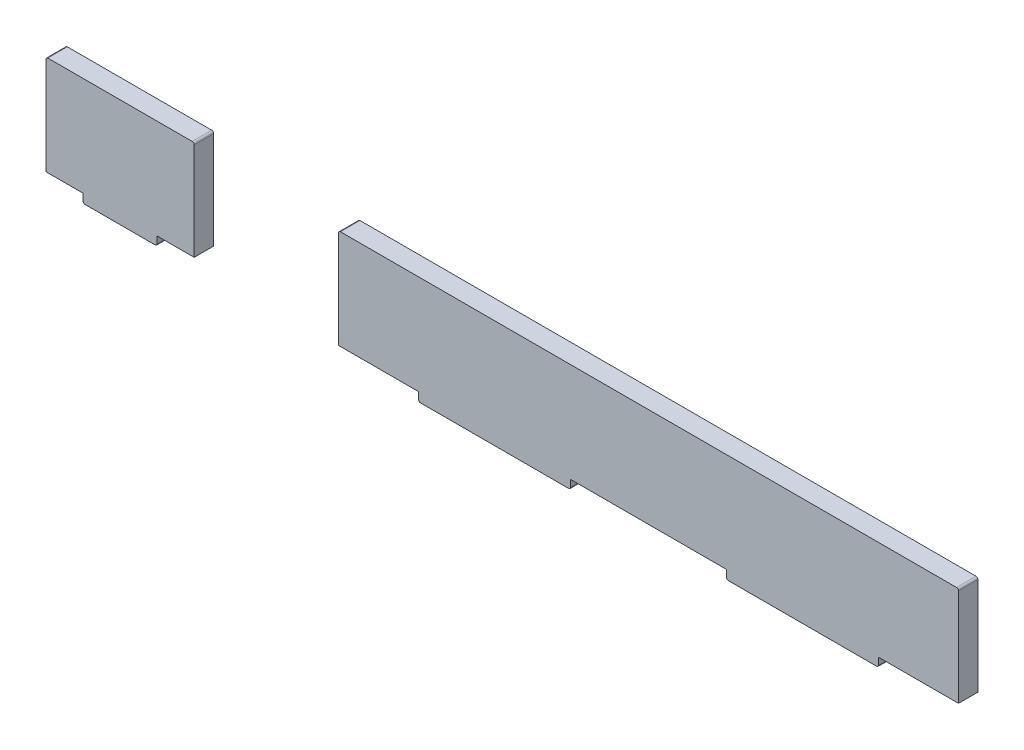
ISO-10303-21;
HEADER;
FILE_DESCRIPTION(('STEP AP214'),'2;1');
FILE_NAME('part.step','',(''),(''),'','','');
FILE_SCHEMA(('AUTOMOTIVE_DESIGN { 1 0 10303 214 1 1 1 1 }'));
ENDSEC;
DATA;
#1=APPLICATION_CONTEXT('core data for automotive mechanical design processes');
#2=APPLICATION_PROTOCOL_DEFINITION('international standard','automotive_design',2000,#1);
#3=PRODUCT_CONTEXT('',#1,'mechanical');
#4=PRODUCT('Part','Part','',(#3));
#5=PRODUCT_RELATED_PRODUCT_CATEGORY('part','',(#4));
#6=PRODUCT_DEFINITION_FORMATION('','',#4);
#7=PRODUCT_DEFINITION_CONTEXT('part definition',#1,'design');
#8=PRODUCT_DEFINITION('design','',#6,#7);
#9=PRODUCT_DEFINITION_SHAPE('','',#8);
#10=(LENGTH_UNIT() NAMED_UNIT(*) SI_UNIT(.MILLI.,.METRE.));
#11=(NAMED_UNIT(*) PLANE_ANGLE_UNIT() SI_UNIT($,.RADIAN.));
#12=(NAMED_UNIT(*) SI_UNIT($,.STERADIAN.) SOLID_ANGLE_UNIT());
#13=UNCERTAINTY_MEASURE_WITH_UNIT(LENGTH_MEASURE(1.E-05),#10,'distance_accuracy_value','');
#14=(GEOMETRIC_REPRESENTATION_CONTEXT(3) GLOBAL_UNCERTAINTY_ASSIGNED_CONTEXT((#13)) GLOBAL_UNIT_ASSIGNED_CONTEXT((#10,
#11,#12)) REPRESENTATION_CONTEXT('',''));
#15=CARTESIAN_POINT('',(0.,0.,0.));
#16=DIRECTION('',(0.,0.,1.));
#17=DIRECTION('',(1.,0.,0.));
#18=AXIS2_PLACEMENT_3D('',#15,#16,#17);
#19=CARTESIAN_POINT('',(41.,0.,10.));
#20=DIRECTION('',(1.,0.,0.));
#21=DIRECTION('',(0.,0.,-1.));
#22=AXIS2_PLACEMENT_3D('',#19,#20,#21);
#23=PLANE('',#22);
#24=DIRECTION('',(0.,-1.,0.));
#25=VECTOR('',#24,1.);
#26=CARTESIAN_POINT('',(41.,0.,0.));
#27=LINE('',#26,#25);
#28=CARTESIAN_POINT('',(41.,0.,0.));
#29=VERTEX_POINT('',#28);
#30=CARTESIAN_POINT('',(41.,-3.5,0.));
#31=VERTEX_POINT('',#30);
#32=EDGE_CURVE('E339',#29,#31,#27,.T.);
#33=ORIENTED_EDGE('',*,*,#32,.T.);
#34=DIRECTION('',(0.,0.,-1.));
#35=VECTOR('',#34,1.);
#36=CARTESIAN_POINT('',(41.,-3.5,10.));
#37=LINE('',#36,#35);
#38=CARTESIAN_POINT('',(41.,-3.5,10.));
#39=VERTEX_POINT('',#38);
#40=EDGE_CURVE('E13',#39,#31,#37,.T.);
#41=ORIENTED_EDGE('',*,*,#40,.F.);
#42=DIRECTION('',(0.,-1.,0.));
#43=VECTOR('',#42,1.);
#44=CARTESIAN_POINT('',(41.,0.,10.));
#45=LINE('',#44,#43);
#46=CARTESIAN_POINT('',(41.,0.,10.));
#47=VERTEX_POINT('',#46);
#48=EDGE_CURVE('E275',#47,#39,#45,.T.);
#49=ORIENTED_EDGE('',*,*,#48,.F.);
#50=DIRECTION('',(0.,0.,-1.));
#51=VECTOR('',#50,1.);
#52=CARTESIAN_POINT('',(41.,0.,10.));
#53=LINE('',#52,#51);
#54=EDGE_CURVE('E202',#47,#29,#53,.T.);
#55=ORIENTED_EDGE('',*,*,#54,.T.);
#56=EDGE_LOOP('',(#33,#41,#49,#55));
#57=FACE_BOUND('',#56,.T.);
#58=ADVANCED_FACE('F47',(#57),#23,.F.);
#59=CARTESIAN_POINT('',(42.,-3.5,10.));
#60=DIRECTION('',(0.,0.,-1.));
#61=DIRECTION('',(-1.,0.,0.));
#62=AXIS2_PLACEMENT_3D('',#59,#60,#61);
#63=CYLINDRICAL_SURFACE('',#62,1.00000000000001);
#64=CARTESIAN_POINT('',(42.,-3.5,0.));
#65=DIRECTION('',(0.,0.,1.));
#66=DIRECTION('',(-1.,0.,0.));
#67=AXIS2_PLACEMENT_3D('',#64,#65,#66);
#68=CIRCLE('',#67,1.00000000000001);
#69=CARTESIAN_POINT('',(42.0000000000001,-4.5,0.));
#70=VERTEX_POINT('',#69);
#71=EDGE_CURVE('E333',#31,#70,#68,.T.);
#72=ORIENTED_EDGE('',*,*,#71,.T.);
#73=DIRECTION('',(0.,0.,-1.));
#74=VECTOR('',#73,1.);
#75=CARTESIAN_POINT('',(42.0000000000001,-4.5,10.));
#76=LINE('',#75,#74);
#77=CARTESIAN_POINT('',(42.0000000000001,-4.5,10.));
#78=VERTEX_POINT('',#77);
#79=EDGE_CURVE('E55',#78,#70,#76,.T.);
#80=ORIENTED_EDGE('',*,*,#79,.F.);
#81=CARTESIAN_POINT('',(42.,-3.5,10.));
#82=DIRECTION('',(0.,0.,1.));
#83=DIRECTION('',(-1.,0.,0.));
#84=AXIS2_PLACEMENT_3D('',#81,#82,#83);
#85=CIRCLE('',#84,1.00000000000001);
#86=EDGE_CURVE('E136',#39,#78,#85,.T.);
#87=ORIENTED_EDGE('',*,*,#86,.F.);
#88=ORIENTED_EDGE('',*,*,#40,.T.);
#89=EDGE_LOOP('',(#72,#80,#87,#88));
#90=FACE_BOUND('',#89,.T.);
#91=ADVANCED_FACE('F380',(#90),#63,.T.);
#92=CARTESIAN_POINT('',(42.0000000000001,-4.5,10.));
#93=DIRECTION('',(0.,1.,0.));
#94=DIRECTION('',(0.,0.,1.));
#95=AXIS2_PLACEMENT_3D('',#92,#93,#94);
#96=PLANE('',#95);
#97=DIRECTION('',(1.,0.,0.));
#98=VECTOR('',#97,1.);
#99=CARTESIAN_POINT('',(42.0000000000001,-4.5,0.));
#100=LINE('',#99,#98);
#101=CARTESIAN_POINT('',(118.,-4.49999999999999,0.));
#102=VERTEX_POINT('',#101);
#103=EDGE_CURVE('E328',#70,#102,#100,.T.);
#104=ORIENTED_EDGE('',*,*,#103,.T.);
#105=DIRECTION('',(0.,0.,-1.));
#106=VECTOR('',#105,1.);
#107=CARTESIAN_POINT('',(118.,-4.49999999999999,10.));
#108=LINE('',#107,#106);
#109=CARTESIAN_POINT('',(118.,-4.49999999999999,10.));
#110=VERTEX_POINT('',#109);
#111=EDGE_CURVE('E320',#110,#102,#108,.T.);
#112=ORIENTED_EDGE('',*,*,#111,.F.);
#113=DIRECTION('',(1.,0.,0.));
#114=VECTOR('',#113,1.);
#115=CARTESIAN_POINT('',(42.0000000000001,-4.5,10.));
#116=LINE('',#115,#114);
#117=EDGE_CURVE('E269',#78,#110,#116,.T.);
#118=ORIENTED_EDGE('',*,*,#117,.F.);
#119=ORIENTED_EDGE('',*,*,#79,.T.);
#120=EDGE_LOOP('',(#104,#112,#118,#119));
#121=FACE_BOUND('',#120,.T.);
#122=ADVANCED_FACE('F326',(#121),#96,.F.);
#123=CARTESIAN_POINT('',(118.,-3.50000000000001,10.));
#124=DIRECTION('',(0.,0.,-1.));
#125=DIRECTION('',(-1.,0.,0.));
#126=AXIS2_PLACEMENT_3D('',#123,#124,#125);
#127=CYLINDRICAL_SURFACE('',#126,0.99999999999998);
#128=CARTESIAN_POINT('',(118.,-3.50000000000001,0.));
#129=DIRECTION('',(0.,0.,1.));
#130=DIRECTION('',(-1.,0.,0.));
#131=AXIS2_PLACEMENT_3D('',#128,#129,#130);
#132=CIRCLE('',#131,0.99999999999998);
#133=CARTESIAN_POINT('',(119.,-3.50000000000001,0.));
#134=VERTEX_POINT('',#133);
#135=EDGE_CURVE('E335',#102,#134,#132,.T.);
#136=ORIENTED_EDGE('',*,*,#135,.T.);
#137=DIRECTION('',(0.,0.,-1.));
#138=VECTOR('',#137,1.);
#139=CARTESIAN_POINT('',(119.,-3.50000000000001,10.));
#140=LINE('',#139,#138);
#141=CARTESIAN_POINT('',(119.,-3.50000000000001,10.));
#142=VERTEX_POINT('',#141);
#143=EDGE_CURVE('E317',#142,#134,#140,.T.);
#144=ORIENTED_EDGE('',*,*,#143,.F.);
#145=CARTESIAN_POINT('',(118.,-3.50000000000001,10.));
#146=DIRECTION('',(0.,0.,1.));
#147=DIRECTION('',(-1.,0.,0.));
#148=AXIS2_PLACEMENT_3D('',#145,#146,#147);
#149=CIRCLE('',#148,0.99999999999998);
#150=EDGE_CURVE('E261',#110,#142,#149,.T.);
#151=ORIENTED_EDGE('',*,*,#150,.F.);
#152=ORIENTED_EDGE('',*,*,#111,.T.);
#153=EDGE_LOOP('',(#136,#144,#151,#152));
#154=FACE_BOUND('',#153,.T.);
#155=ADVANCED_FACE('F387',(#154),#127,.T.);
#156=CARTESIAN_POINT('',(119.,0.,10.));
#157=DIRECTION('',(-1.,0.,0.));
#158=DIRECTION('',(0.,-1.,0.));
#159=AXIS2_PLACEMENT_3D('',#156,#157,#158);
#160=PLANE('',#159);
#161=DIRECTION('',(0.,1.,0.));
#162=VECTOR('',#161,1.);
#163=CARTESIAN_POINT('',(119.,0.,0.));
#164=LINE('',#163,#162);
#165=CARTESIAN_POINT('',(119.,0.,0.));
#166=VERTEX_POINT('',#165);
#167=EDGE_CURVE('E337',#134,#166,#164,.T.);
#168=ORIENTED_EDGE('',*,*,#167,.T.);
#169=DIRECTION('',(0.,0.,-1.));
#170=VECTOR('',#169,1.);
#171=CARTESIAN_POINT('',(119.,0.,10.));
#172=LINE('',#171,#170);
#173=CARTESIAN_POINT('',(119.,0.,10.));
#174=VERTEX_POINT('',#173);
#175=EDGE_CURVE('E314',#174,#166,#172,.T.);
#176=ORIENTED_EDGE('',*,*,#175,.F.);
#177=DIRECTION('',(0.,1.,0.));
#178=VECTOR('',#177,1.);
#179=CARTESIAN_POINT('',(119.,0.,10.));
#180=LINE('',#179,#178);
#181=EDGE_CURVE('E257',#142,#174,#180,.T.);
#182=ORIENTED_EDGE('',*,*,#181,.F.);
#183=ORIENTED_EDGE('',*,*,#143,.T.);
#184=EDGE_LOOP('',(#168,#176,#182,#183));
#185=FACE_BOUND('',#184,.T.);
#186=ADVANCED_FACE('F392',(#185),#160,.F.);
#187=CARTESIAN_POINT('',(119.,0.,10.));
#188=DIRECTION('',(0.,1.,0.));
#189=DIRECTION('',(0.,0.,1.));
#190=AXIS2_PLACEMENT_3D('',#187,#188,#189);
#191=PLANE('',#190);
#192=DIRECTION('',(1.,0.,0.));
#193=VECTOR('',#192,1.);
#194=CARTESIAN_POINT('',(119.,0.,0.));
#195=LINE('',#194,#193);
#196=CARTESIAN_POINT('',(199.,0.,0.));
#197=VERTEX_POINT('',#196);
#198=EDGE_CURVE('E343',#166,#197,#195,.T.);
#199=ORIENTED_EDGE('',*,*,#198,.T.);
#200=DIRECTION('',(0.,0.,-1.));
#201=VECTOR('',#200,1.);
#202=CARTESIAN_POINT('',(199.,0.,10.));
#203=LINE('',#202,#201);
#204=CARTESIAN_POINT('',(199.,0.,10.));
#205=VERTEX_POINT('',#204);
#206=EDGE_CURVE('E311',#205,#197,#203,.T.);
#207=ORIENTED_EDGE('',*,*,#206,.F.);
#208=DIRECTION('',(1.,0.,0.));
#209=VECTOR('',#208,1.);
#210=CARTESIAN_POINT('',(119.,0.,10.));
#211=LINE('',#210,#209);
#212=EDGE_CURVE('E253',#174,#205,#211,.T.);
#213=ORIENTED_EDGE('',*,*,#212,.F.);
#214=ORIENTED_EDGE('',*,*,#175,.T.);
#215=EDGE_LOOP('',(#199,#207,#213,#214));
#216=FACE_BOUND('',#215,.T.);
#217=ADVANCED_FACE('F396',(#216),#191,.F.);
#218=CARTESIAN_POINT('',(199.,0.,10.));
#219=DIRECTION('',(1.,0.,0.));
#220=DIRECTION('',(0.,0.,-1.));
#221=AXIS2_PLACEMENT_3D('',#218,#219,#220);
#222=PLANE('',#221);
#223=DIRECTION('',(0.,-1.,0.));
#224=VECTOR('',#223,1.);
#225=CARTESIAN_POINT('',(199.,0.,0.));
#226=LINE('',#225,#224);
#227=CARTESIAN_POINT('',(199.,-3.50000000000001,0.));
#228=VERTEX_POINT('',#227);
#229=EDGE_CURVE('E345',#197,#228,#226,.T.);
#230=ORIENTED_EDGE('',*,*,#229,.T.);
#231=DIRECTION('',(0.,0.,-1.));
#232=VECTOR('',#231,1.);
#233=CARTESIAN_POINT('',(199.,-3.50000000000001,10.));
#234=LINE('',#233,#232);
#235=CARTESIAN_POINT('',(199.,-3.50000000000001,10.));
#236=VERTEX_POINT('',#235);
#237=EDGE_CURVE('E308',#236,#228,#234,.T.);
#238=ORIENTED_EDGE('',*,*,#237,.F.);
#239=DIRECTION('',(0.,-1.,0.));
#240=VECTOR('',#239,1.);
#241=CARTESIAN_POINT('',(199.,0.,10.));
#242=LINE('',#241,#240);
#243=EDGE_CURVE('E250',#205,#236,#242,.T.);
#244=ORIENTED_EDGE('',*,*,#243,.F.);
#245=ORIENTED_EDGE('',*,*,#206,.T.);
#246=EDGE_LOOP('',(#230,#238,#244,#245));
#247=FACE_BOUND('',#246,.T.);
#248=ADVANCED_FACE('F400',(#247),#222,.F.);
#249=CARTESIAN_POINT('',(200.,-3.50000000000001,10.));
#250=DIRECTION('',(0.,0.,-1.));
#251=DIRECTION('',(-1.,0.,0.));
#252=AXIS2_PLACEMENT_3D('',#249,#250,#251);
#253=CYLINDRICAL_SURFACE('',#252,0.99999999999998);
#254=CARTESIAN_POINT('',(200.,-3.50000000000001,0.));
#255=DIRECTION('',(0.,0.,1.));
#256=DIRECTION('',(-1.,0.,0.));
#257=AXIS2_PLACEMENT_3D('',#254,#255,#256);
#258=CIRCLE('',#257,0.99999999999998);
#259=CARTESIAN_POINT('',(200.,-4.5,0.));
#260=VERTEX_POINT('',#259);
#261=EDGE_CURVE('E347',#228,#260,#258,.T.);
#262=ORIENTED_EDGE('',*,*,#261,.T.);
#263=DIRECTION('',(0.,0.,-1.));
#264=VECTOR('',#263,1.);
#265=CARTESIAN_POINT('',(200.,-4.5,10.));
#266=LINE('',#265,#264);
#267=CARTESIAN_POINT('',(200.,-4.5,10.));
#268=VERTEX_POINT('',#267);
#269=EDGE_CURVE('E305',#268,#260,#266,.T.);
#270=ORIENTED_EDGE('',*,*,#269,.F.);
#271=CARTESIAN_POINT('',(200.,-3.50000000000001,10.));
#272=DIRECTION('',(0.,0.,1.));
#273=DIRECTION('',(-1.,0.,0.));
#274=AXIS2_PLACEMENT_3D('',#271,#272,#273);
#275=CIRCLE('',#274,0.99999999999998);
#276=EDGE_CURVE('E242',#236,#268,#275,.T.);
#277=ORIENTED_EDGE('',*,*,#276,.F.);
#278=ORIENTED_EDGE('',*,*,#237,.T.);
#279=EDGE_LOOP('',(#262,#270,#277,#278));
#280=FACE_BOUND('',#279,.T.);
#281=ADVANCED_FACE('F404',(#280),#253,.T.);
#282=CARTESIAN_POINT('',(200.,-4.5,10.));
#283=DIRECTION('',(0.,1.,0.));
#284=DIRECTION('',(0.,0.,1.));
#285=AXIS2_PLACEMENT_3D('',#282,#283,#284);
#286=PLANE('',#285);
#287=DIRECTION('',(1.,0.,0.));
#288=VECTOR('',#287,1.);
#289=CARTESIAN_POINT('',(200.,-4.5,0.));
#290=LINE('',#289,#288);
#291=CARTESIAN_POINT('',(276.,-4.5,0.));
#292=VERTEX_POINT('',#291);
#293=EDGE_CURVE('E349',#260,#292,#290,.T.);
#294=ORIENTED_EDGE('',*,*,#293,.T.);
#295=DIRECTION('',(0.,0.,-1.));
#296=VECTOR('',#295,1.);
#297=CARTESIAN_POINT('',(276.,-4.5,10.));
#298=LINE('',#297,#296);
#299=CARTESIAN_POINT('',(276.,-4.5,10.));
#300=VERTEX_POINT('',#299);
#301=EDGE_CURVE('E302',#300,#292,#298,.T.);
#302=ORIENTED_EDGE('',*,*,#301,.F.);
#303=DIRECTION('',(1.,0.,0.));
#304=VECTOR('',#303,1.);
#305=CARTESIAN_POINT('',(200.,-4.5,10.));
#306=LINE('',#305,#304);
#307=EDGE_CURVE('E238',#268,#300,#306,.T.);
#308=ORIENTED_EDGE('',*,*,#307,.F.);
#309=ORIENTED_EDGE('',*,*,#269,.T.);
#310=EDGE_LOOP('',(#294,#302,#308,#309));
#311=FACE_BOUND('',#310,.T.);
#312=ADVANCED_FACE('F408',(#311),#286,.F.);
#313=CARTESIAN_POINT('',(276.,-3.5,10.));
#314=DIRECTION('',(0.,0.,-1.));
#315=DIRECTION('',(-1.,0.,0.));
#316=AXIS2_PLACEMENT_3D('',#313,#314,#315);
#317=CYLINDRICAL_SURFACE('',#316,1.);
#318=CARTESIAN_POINT('',(276.,-3.5,0.));
#319=DIRECTION('',(0.,0.,1.));
#320=DIRECTION('',(-1.,0.,0.));
#321=AXIS2_PLACEMENT_3D('',#318,#319,#320);
#322=CIRCLE('',#321,1.);
#323=CARTESIAN_POINT('',(277.,-3.5,0.));
#324=VERTEX_POINT('',#323);
#325=EDGE_CURVE('E351',#292,#324,#322,.T.);
#326=ORIENTED_EDGE('',*,*,#325,.T.);
#327=DIRECTION('',(0.,0.,-1.));
#328=VECTOR('',#327,1.);
#329=CARTESIAN_POINT('',(277.,-3.5,10.));
#330=LINE('',#329,#328);
#331=CARTESIAN_POINT('',(277.,-3.5,10.));
#332=VERTEX_POINT('',#331);
#333=EDGE_CURVE('E299',#332,#324,#330,.T.);
#334=ORIENTED_EDGE('',*,*,#333,.F.);
#335=CARTESIAN_POINT('',(276.,-3.5,10.));
#336=DIRECTION('',(0.,0.,1.));
#337=DIRECTION('',(-1.,0.,0.));
#338=AXIS2_PLACEMENT_3D('',#335,#336,#337);
#339=CIRCLE('',#338,1.);
#340=EDGE_CURVE('E234',#300,#332,#339,.T.);
#341=ORIENTED_EDGE('',*,*,#340,.F.);
#342=ORIENTED_EDGE('',*,*,#301,.T.);
#343=EDGE_LOOP('',(#326,#334,#341,#342));
#344=FACE_BOUND('',#343,.T.);
#345=ADVANCED_FACE('F412',(#344),#317,.T.);
#346=CARTESIAN_POINT('',(277.,0.,10.));
#347=DIRECTION('',(-1.,0.,0.));
#348=DIRECTION('',(0.,-1.,0.));
#349=AXIS2_PLACEMENT_3D('',#346,#347,#348);
#350=PLANE('',#349);
#351=DIRECTION('',(0.,1.,0.));
#352=VECTOR('',#351,1.);
#353=CARTESIAN_POINT('',(277.,0.,0.));
#354=LINE('',#353,#352);
#355=CARTESIAN_POINT('',(277.,0.,0.));
#356=VERTEX_POINT('',#355);
#357=EDGE_CURVE('E353',#324,#356,#354,.T.);
#358=ORIENTED_EDGE('',*,*,#357,.T.);
#359=DIRECTION('',(0.,0.,-1.));
#360=VECTOR('',#359,1.);
#361=CARTESIAN_POINT('',(277.,0.,10.));
#362=LINE('',#361,#360);
#363=CARTESIAN_POINT('',(277.,0.,10.));
#364=VERTEX_POINT('',#363);
#365=EDGE_CURVE('E296',#364,#356,#362,.T.);
#366=ORIENTED_EDGE('',*,*,#365,.F.);
#367=DIRECTION('',(0.,1.,0.));
#368=VECTOR('',#367,1.);
#369=CARTESIAN_POINT('',(277.,0.,10.));
#370=LINE('',#369,#368);
#371=EDGE_CURVE('E231',#332,#364,#370,.T.);
#372=ORIENTED_EDGE('',*,*,#371,.F.);
#373=ORIENTED_EDGE('',*,*,#333,.T.);
#374=EDGE_LOOP('',(#358,#366,#372,#373));
#375=FACE_BOUND('',#374,.T.);
#376=ADVANCED_FACE('F416',(#375),#350,.F.);
#377=CARTESIAN_POINT('',(277.,0.,10.));
#378=DIRECTION('',(0.,1.,0.));
#379=DIRECTION('',(0.,0.,1.));
#380=AXIS2_PLACEMENT_3D('',#377,#378,#379);
#381=PLANE('',#380);
#382=DIRECTION('',(1.,0.,0.));
#383=VECTOR('',#382,1.);
#384=CARTESIAN_POINT('',(277.,0.,0.));
#385=LINE('',#384,#383);
#386=CARTESIAN_POINT('',(318.,0.,0.));
#387=VERTEX_POINT('',#386);
#388=EDGE_CURVE('E355',#356,#387,#385,.T.);
#389=ORIENTED_EDGE('',*,*,#388,.T.);
#390=DIRECTION('',(0.,0.,-1.));
#391=VECTOR('',#390,1.);
#392=CARTESIAN_POINT('',(318.,0.,10.));
#393=LINE('',#392,#391);
#394=CARTESIAN_POINT('',(318.,0.,10.));
#395=VERTEX_POINT('',#394);
#396=EDGE_CURVE('E293',#395,#387,#393,.T.);
#397=ORIENTED_EDGE('',*,*,#396,.F.);
#398=DIRECTION('',(1.,0.,0.));
#399=VECTOR('',#398,1.);
#400=CARTESIAN_POINT('',(277.,0.,10.));
#401=LINE('',#400,#399);
#402=EDGE_CURVE('E223',#364,#395,#401,.T.);
#403=ORIENTED_EDGE('',*,*,#402,.F.);
#404=ORIENTED_EDGE('',*,*,#365,.T.);
#405=EDGE_LOOP('',(#389,#397,#403,#404));
#406=FACE_BOUND('',#405,.T.);
#407=ADVANCED_FACE('F420',(#406),#381,.F.);
#408=CARTESIAN_POINT('',(318.,50.,10.));
#409=DIRECTION('',(-1.,0.,0.));
#410=DIRECTION('',(0.,0.,1.));
#411=AXIS2_PLACEMENT_3D('',#408,#409,#410);
#412=PLANE('',#411);
#413=DIRECTION('',(0.,1.,0.));
#414=VECTOR('',#413,1.);
#415=CARTESIAN_POINT('',(318.,50.,0.));
#416=LINE('',#415,#414);
#417=CARTESIAN_POINT('',(318.,50.,0.));
#418=VERTEX_POINT('',#417);
#419=EDGE_CURVE('E357',#387,#418,#416,.T.);
#420=ORIENTED_EDGE('',*,*,#419,.T.);
#421=DIRECTION('',(0.,0.,-1.));
#422=VECTOR('',#421,1.);
#423=CARTESIAN_POINT('',(318.,50.,10.));
#424=LINE('',#423,#422);
#425=CARTESIAN_POINT('',(318.,50.,10.));
#426=VERTEX_POINT('',#425);
#427=EDGE_CURVE('E290',#426,#418,#424,.T.);
#428=ORIENTED_EDGE('',*,*,#427,.F.);
#429=DIRECTION('',(0.,1.,0.));
#430=VECTOR('',#429,1.);
#431=CARTESIAN_POINT('',(318.,50.,10.));
#432=LINE('',#431,#430);
#433=EDGE_CURVE('E219',#395,#426,#432,.T.);
#434=ORIENTED_EDGE('',*,*,#433,.F.);
#435=ORIENTED_EDGE('',*,*,#396,.T.);
#436=EDGE_LOOP('',(#420,#428,#434,#435));
#437=FACE_BOUND('',#436,.T.);
#438=ADVANCED_FACE('F424',(#437),#412,.F.);
#439=CARTESIAN_POINT('',(317.,50.,10.));
#440=DIRECTION('',(0.,0.,-1.));
#441=DIRECTION('',(-1.,0.,0.));
#442=AXIS2_PLACEMENT_3D('',#439,#440,#441);
#443=CYLINDRICAL_SURFACE('',#442,1.);
#444=CARTESIAN_POINT('',(317.,50.,0.));
#445=DIRECTION('',(0.,0.,1.));
#446=DIRECTION('',(1.,0.,0.));
#447=AXIS2_PLACEMENT_3D('',#444,#445,#446);
#448=CIRCLE('',#447,1.);
#449=CARTESIAN_POINT('',(317.,51.,0.));
#450=VERTEX_POINT('',#449);
#451=EDGE_CURVE('E359',#418,#450,#448,.T.);
#452=ORIENTED_EDGE('',*,*,#451,.T.);
#453=DIRECTION('',(0.,0.,-1.));
#454=VECTOR('',#453,1.);
#455=CARTESIAN_POINT('',(317.,51.,10.));
#456=LINE('',#455,#454);
#457=CARTESIAN_POINT('',(317.,51.,10.));
#458=VERTEX_POINT('',#457);
#459=EDGE_CURVE('E287',#458,#450,#456,.T.);
#460=ORIENTED_EDGE('',*,*,#459,.F.);
#461=CARTESIAN_POINT('',(317.,50.,10.));
#462=DIRECTION('',(0.,0.,1.));
#463=DIRECTION('',(1.,0.,0.));
#464=AXIS2_PLACEMENT_3D('',#461,#462,#463);
#465=CIRCLE('',#464,1.);
#466=EDGE_CURVE('E215',#426,#458,#465,.T.);
#467=ORIENTED_EDGE('',*,*,#466,.F.);
#468=ORIENTED_EDGE('',*,*,#427,.T.);
#469=EDGE_LOOP('',(#452,#460,#467,#468));
#470=FACE_BOUND('',#469,.T.);
#471=ADVANCED_FACE('F428',(#470),#443,.T.);
#472=CARTESIAN_POINT('',(1.,51.,10.));
#473=DIRECTION('',(0.,-1.,0.));
#474=DIRECTION('',(0.,0.,-1.));
#475=AXIS2_PLACEMENT_3D('',#472,#473,#474);
#476=PLANE('',#475);
#477=DIRECTION('',(-1.,0.,0.));
#478=VECTOR('',#477,1.);
#479=CARTESIAN_POINT('',(1.,51.,0.));
#480=LINE('',#479,#478);
#481=CARTESIAN_POINT('',(1.,51.,0.));
#482=VERTEX_POINT('',#481);
#483=EDGE_CURVE('E361',#450,#482,#480,.T.);
#484=ORIENTED_EDGE('',*,*,#483,.T.);
#485=DIRECTION('',(0.,0.,-1.));
#486=VECTOR('',#485,1.);
#487=CARTESIAN_POINT('',(1.,51.,10.));
#488=LINE('',#487,#486);
#489=CARTESIAN_POINT('',(1.,51.,10.));
#490=VERTEX_POINT('',#489);
#491=EDGE_CURVE('E195',#490,#482,#488,.T.);
#492=ORIENTED_EDGE('',*,*,#491,.F.);
#493=DIRECTION('',(-1.,0.,0.));
#494=VECTOR('',#493,1.);
#495=CARTESIAN_POINT('',(1.,51.,10.));
#496=LINE('',#495,#494);
#497=EDGE_CURVE('E185',#458,#490,#496,.T.);
#498=ORIENTED_EDGE('',*,*,#497,.F.);
#499=ORIENTED_EDGE('',*,*,#459,.T.);
#500=EDGE_LOOP('',(#484,#492,#498,#499));
#501=FACE_BOUND('',#500,.T.);
#502=ADVANCED_FACE('F364',(#501),#476,.F.);
#503=CARTESIAN_POINT('',(1.,50.,10.));
#504=DIRECTION('',(0.,0.,-1.));
#505=DIRECTION('',(-1.,0.,0.));
#506=AXIS2_PLACEMENT_3D('',#503,#504,#505);
#507=CYLINDRICAL_SURFACE('',#506,0.999999999999973);
#508=CARTESIAN_POINT('',(1.,50.,0.));
#509=DIRECTION('',(0.,0.,1.));
#510=DIRECTION('',(1.,0.,0.));
#511=AXIS2_PLACEMENT_3D('',#508,#509,#510);
#512=CIRCLE('',#511,0.999999999999973);
#513=CARTESIAN_POINT('',(0.,50.,0.));
#514=VERTEX_POINT('',#513);
#515=EDGE_CURVE('E194',#482,#514,#512,.T.);
#516=ORIENTED_EDGE('',*,*,#515,.T.);
#517=DIRECTION('',(0.,0.,-1.));
#518=VECTOR('',#517,1.);
#519=CARTESIAN_POINT('',(0.,50.,10.));
#520=LINE('',#519,#518);
#521=CARTESIAN_POINT('',(0.,50.,10.));
#522=VERTEX_POINT('',#521);
#523=EDGE_CURVE('E191',#522,#514,#520,.T.);
#524=ORIENTED_EDGE('',*,*,#523,.F.);
#525=CARTESIAN_POINT('',(1.,50.,10.));
#526=DIRECTION('',(0.,0.,1.));
#527=DIRECTION('',(1.,0.,0.));
#528=AXIS2_PLACEMENT_3D('',#525,#526,#527);
#529=CIRCLE('',#528,0.999999999999973);
#530=EDGE_CURVE('E179',#490,#522,#529,.T.);
#531=ORIENTED_EDGE('',*,*,#530,.F.);
#532=ORIENTED_EDGE('',*,*,#491,.T.);
#533=EDGE_LOOP('',(#516,#524,#531,#532));
#534=FACE_BOUND('',#533,.T.);
#535=ADVANCED_FACE('F192',(#534),#507,.T.);
#536=CARTESIAN_POINT('',(0.,50.,10.));
#537=DIRECTION('',(1.,0.,0.));
#538=DIRECTION('',(0.,1.,0.));
#539=AXIS2_PLACEMENT_3D('',#536,#537,#538);
#540=PLANE('',#539);
#541=DIRECTION('',(0.,-1.,0.));
#542=VECTOR('',#541,1.);
#543=CARTESIAN_POINT('',(0.,50.,0.));
#544=LINE('',#543,#542);
#545=CARTESIAN_POINT('',(0.,0.,0.));
#546=VERTEX_POINT('',#545);
#547=EDGE_CURVE('E122',#514,#546,#544,.T.);
#548=ORIENTED_EDGE('',*,*,#547,.T.);
#549=DIRECTION('',(0.,0.,-1.));
#550=VECTOR('',#549,1.);
#551=CARTESIAN_POINT('',(0.,0.,10.));
#552=LINE('',#551,#550);
#553=CARTESIAN_POINT('',(0.,0.,10.));
#554=VERTEX_POINT('',#553);
#555=EDGE_CURVE('E196',#554,#546,#552,.T.);
#556=ORIENTED_EDGE('',*,*,#555,.F.);
#557=DIRECTION('',(0.,-1.,0.));
#558=VECTOR('',#557,1.);
#559=CARTESIAN_POINT('',(0.,50.,10.));
#560=LINE('',#559,#558);
#561=EDGE_CURVE('E183',#522,#554,#560,.T.);
#562=ORIENTED_EDGE('',*,*,#561,.F.);
#563=ORIENTED_EDGE('',*,*,#523,.T.);
#564=EDGE_LOOP('',(#548,#556,#562,#563));
#565=FACE_BOUND('',#564,.T.);
#566=ADVANCED_FACE('F198',(#565),#540,.F.);
#567=CARTESIAN_POINT('',(0.,0.,10.));
#568=DIRECTION('',(0.,1.,0.));
#569=DIRECTION('',(0.,0.,1.));
#570=AXIS2_PLACEMENT_3D('',#567,#568,#569);
#571=PLANE('',#570);
#572=DIRECTION('',(1.,0.,0.));
#573=VECTOR('',#572,1.);
#574=CARTESIAN_POINT('',(0.,0.,0.));
#575=LINE('',#574,#573);
#576=EDGE_CURVE('E128',#546,#29,#575,.T.);
#577=ORIENTED_EDGE('',*,*,#576,.T.);
#578=ORIENTED_EDGE('',*,*,#54,.F.);
#579=DIRECTION('',(1.,0.,0.));
#580=VECTOR('',#579,1.);
#581=CARTESIAN_POINT('',(0.,0.,10.));
#582=LINE('',#581,#580);
#583=EDGE_CURVE('E63',#554,#47,#582,.T.);
#584=ORIENTED_EDGE('',*,*,#583,.F.);
#585=ORIENTED_EDGE('',*,*,#555,.T.);
#586=EDGE_LOOP('',(#577,#578,#584,#585));
#587=FACE_BOUND('',#586,.T.);
#588=ADVANCED_FACE('F369',(#587),#571,.F.);
#589=CARTESIAN_POINT('',(42.,-3.5,10.));
#590=DIRECTION('',(0.,0.,-1.));
#591=DIRECTION('',(-1.,0.,0.));
#592=AXIS2_PLACEMENT_3D('',#589,#590,#591);
#593=PLANE('',#592);
#594=ORIENTED_EDGE('',*,*,#48,.T.);
#595=ORIENTED_EDGE('',*,*,#86,.T.);
#596=ORIENTED_EDGE('',*,*,#117,.T.);
#597=ORIENTED_EDGE('',*,*,#150,.T.);
#598=ORIENTED_EDGE('',*,*,#181,.T.);
#599=ORIENTED_EDGE('',*,*,#212,.T.);
#600=ORIENTED_EDGE('',*,*,#243,.T.);
#601=ORIENTED_EDGE('',*,*,#276,.T.);
#602=ORIENTED_EDGE('',*,*,#307,.T.);
#603=ORIENTED_EDGE('',*,*,#340,.T.);
#604=ORIENTED_EDGE('',*,*,#371,.T.);
#605=ORIENTED_EDGE('',*,*,#402,.T.);
#606=ORIENTED_EDGE('',*,*,#433,.T.);
#607=ORIENTED_EDGE('',*,*,#466,.T.);
#608=ORIENTED_EDGE('',*,*,#497,.T.);
#609=ORIENTED_EDGE('',*,*,#530,.T.);
#610=ORIENTED_EDGE('',*,*,#561,.T.);
#611=ORIENTED_EDGE('',*,*,#583,.T.);
#612=EDGE_LOOP('',(#594,#595,#596,#597,#598,#599,#600,#601,#602,#603,#604,#605,#606,#607,#608,
#609,#610,#611));
#613=FACE_BOUND('',#612,.T.);
#614=ADVANCED_FACE('F181',(#613),#593,.F.);
#615=CARTESIAN_POINT('',(42.,-3.5,0.));
#616=DIRECTION('',(0.,0.,-1.));
#617=DIRECTION('',(-1.,0.,0.));
#618=AXIS2_PLACEMENT_3D('',#615,#616,#617);
#619=PLANE('',#618);
#620=ORIENTED_EDGE('',*,*,#32,.F.);
#621=ORIENTED_EDGE('',*,*,#576,.F.);
#622=ORIENTED_EDGE('',*,*,#547,.F.);
#623=ORIENTED_EDGE('',*,*,#515,.F.);
#624=ORIENTED_EDGE('',*,*,#483,.F.);
#625=ORIENTED_EDGE('',*,*,#451,.F.);
#626=ORIENTED_EDGE('',*,*,#419,.F.);
#627=ORIENTED_EDGE('',*,*,#388,.F.);
#628=ORIENTED_EDGE('',*,*,#357,.F.);
#629=ORIENTED_EDGE('',*,*,#325,.F.);
#630=ORIENTED_EDGE('',*,*,#293,.F.);
#631=ORIENTED_EDGE('',*,*,#261,.F.);
#632=ORIENTED_EDGE('',*,*,#229,.F.);
#633=ORIENTED_EDGE('',*,*,#198,.F.);
#634=ORIENTED_EDGE('',*,*,#167,.F.);
#635=ORIENTED_EDGE('',*,*,#135,.F.);
#636=ORIENTED_EDGE('',*,*,#103,.F.);
#637=ORIENTED_EDGE('',*,*,#71,.F.);
#638=EDGE_LOOP('',(#620,#621,#622,#623,#624,#625,#626,#627,#628,#629,#630,#631,#632,#633,#634,
#635,#636,#637));
#639=FACE_BOUND('',#638,.T.);
#640=ADVANCED_FACE('F332',(#639),#619,.T.);
#641=CLOSED_SHELL('',(#58,#91,#122,#155,#186,#217,#248,#281,#312,#345,#376,#407,#438,#471,#502,
#535,#566,#588,#614,#640));
#642=MANIFOLD_SOLID_BREP('B2',#641);
#643=CARTESIAN_POINT('',(-74.1181159317202,52.1039152472824,10.));
#644=DIRECTION('',(-1.,0.,0.));
#645=DIRECTION('',(0.,-1.,0.));
#646=AXIS2_PLACEMENT_3D('',#643,#644,#645);
#647=PLANE('',#646);
#648=DIRECTION('',(0.,1.,0.));
#649=VECTOR('',#648,1.);
#650=CARTESIAN_POINT('',(-74.1181159317202,52.1039152472824,0.));
#651=LINE('',#650,#649);
#652=CARTESIAN_POINT('',(-74.1181159317202,2.10391524728237,0.));
#653=VERTEX_POINT('',#652);
#654=CARTESIAN_POINT('',(-74.1181159317202,52.1039152472824,0.));
#655=VERTEX_POINT('',#654);
#656=EDGE_CURVE('E798',#653,#655,#651,.T.);
#657=ORIENTED_EDGE('',*,*,#656,.T.);
#658=DIRECTION('',(0.,0.,-1.));
#659=VECTOR('',#658,1.);
#660=CARTESIAN_POINT('',(-74.1181159317202,52.1039152472824,10.));
#661=LINE('',#660,#659);
#662=CARTESIAN_POINT('',(-74.1181159317202,52.1039152472824,10.));
#663=VERTEX_POINT('',#662);
#664=EDGE_CURVE('E45',#663,#655,#661,.T.);
#665=ORIENTED_EDGE('',*,*,#664,.F.);
#666=DIRECTION('',(0.,1.,0.));
#667=VECTOR('',#666,1.);
#668=CARTESIAN_POINT('',(-74.1181159317202,52.1039152472824,10.));
#669=LINE('',#668,#667);
#670=CARTESIAN_POINT('',(-74.1181159317202,2.10391524728237,10.));
#671=VERTEX_POINT('',#670);
#672=EDGE_CURVE('E751',#671,#663,#669,.T.);
#673=ORIENTED_EDGE('',*,*,#672,.F.);
#674=DIRECTION('',(0.,0.,-1.));
#675=VECTOR('',#674,1.);
#676=CARTESIAN_POINT('',(-74.1181159317202,2.10391524728237,10.));
#677=LINE('',#676,#675);
#678=EDGE_CURVE('E707',#671,#653,#677,.T.);
#679=ORIENTED_EDGE('',*,*,#678,.T.);
#680=EDGE_LOOP('',(#657,#665,#673,#679));
#681=FACE_BOUND('',#680,.T.);
#682=ADVANCED_FACE('F588',(#681),#647,.F.);
#683=CARTESIAN_POINT('',(-75.1181159317202,52.1039152472824,10.));
#684=DIRECTION('',(0.,0.,-1.));
#685=DIRECTION('',(-1.,0.,0.));
#686=AXIS2_PLACEMENT_3D('',#683,#684,#685);
#687=CYLINDRICAL_SURFACE('',#686,1.00000000000002);
#688=CARTESIAN_POINT('',(-75.1181159317202,52.1039152472824,0.));
#689=DIRECTION('',(0.,0.,1.));
#690=DIRECTION('',(1.,0.,0.));
#691=AXIS2_PLACEMENT_3D('',#688,#689,#690);
#692=CIRCLE('',#691,1.00000000000002);
#693=CARTESIAN_POINT('',(-75.1181159317202,53.1039152472824,0.));
#694=VERTEX_POINT('',#693);
#695=EDGE_CURVE('E792',#655,#694,#692,.T.);
#696=ORIENTED_EDGE('',*,*,#695,.T.);
#697=DIRECTION('',(0.,0.,-1.));
#698=VECTOR('',#697,1.);
#699=CARTESIAN_POINT('',(-75.1181159317202,53.1039152472824,10.));
#700=LINE('',#699,#698);
#701=CARTESIAN_POINT('',(-75.1181159317202,53.1039152472824,10.));
#702=VERTEX_POINT('',#701);
#703=EDGE_CURVE('E596',#702,#694,#700,.T.);
#704=ORIENTED_EDGE('',*,*,#703,.F.);
#705=CARTESIAN_POINT('',(-75.1181159317202,52.1039152472824,10.));
#706=DIRECTION('',(0.,0.,1.));
#707=DIRECTION('',(1.,0.,0.));
#708=AXIS2_PLACEMENT_3D('',#705,#706,#707);
#709=CIRCLE('',#708,1.00000000000002);
#710=EDGE_CURVE('E659',#663,#702,#709,.T.);
#711=ORIENTED_EDGE('',*,*,#710,.F.);
#712=ORIENTED_EDGE('',*,*,#664,.T.);
#713=EDGE_LOOP('',(#696,#704,#711,#712));
#714=FACE_BOUND('',#713,.T.);
#715=ADVANCED_FACE('F827',(#714),#687,.T.);
#716=CARTESIAN_POINT('',(-149.11811593172,53.1039152472824,10.));
#717=DIRECTION('',(0.,-1.,0.));
#718=DIRECTION('',(0.,0.,-1.));
#719=AXIS2_PLACEMENT_3D('',#716,#717,#718);
#720=PLANE('',#719);
#721=DIRECTION('',(-1.,0.,0.));
#722=VECTOR('',#721,1.);
#723=CARTESIAN_POINT('',(-149.11811593172,53.1039152472824,0.));
#724=LINE('',#723,#722);
#725=CARTESIAN_POINT('',(-149.11811593172,53.1039152472824,0.));
#726=VERTEX_POINT('',#725);
#727=EDGE_CURVE('E787',#694,#726,#724,.T.);
#728=ORIENTED_EDGE('',*,*,#727,.T.);
#729=DIRECTION('',(0.,0.,-1.));
#730=VECTOR('',#729,1.);
#731=CARTESIAN_POINT('',(-149.11811593172,53.1039152472824,10.));
#732=LINE('',#731,#730);
#733=CARTESIAN_POINT('',(-149.11811593172,53.1039152472824,10.));
#734=VERTEX_POINT('',#733);
#735=EDGE_CURVE('E779',#734,#726,#732,.T.);
#736=ORIENTED_EDGE('',*,*,#735,.F.);
#737=DIRECTION('',(-1.,0.,0.));
#738=VECTOR('',#737,1.);
#739=CARTESIAN_POINT('',(-149.11811593172,53.1039152472824,10.));
#740=LINE('',#739,#738);
#741=EDGE_CURVE('E743',#702,#734,#740,.T.);
#742=ORIENTED_EDGE('',*,*,#741,.F.);
#743=ORIENTED_EDGE('',*,*,#703,.T.);
#744=EDGE_LOOP('',(#728,#736,#742,#743));
#745=FACE_BOUND('',#744,.T.);
#746=ADVANCED_FACE('F785',(#745),#720,.F.);
#747=CARTESIAN_POINT('',(-149.11811593172,52.1039152472824,10.));
#748=DIRECTION('',(0.,0.,-1.));
#749=DIRECTION('',(-1.,0.,0.));
#750=AXIS2_PLACEMENT_3D('',#747,#748,#749);
#751=CYLINDRICAL_SURFACE('',#750,1.00000000000002);
#752=CARTESIAN_POINT('',(-149.11811593172,52.1039152472824,0.));
#753=DIRECTION('',(0.,0.,1.));
#754=DIRECTION('',(1.,0.,0.));
#755=AXIS2_PLACEMENT_3D('',#752,#753,#754);
#756=CIRCLE('',#755,1.00000000000002);
#757=CARTESIAN_POINT('',(-150.11811593172,52.1039152472824,0.));
#758=VERTEX_POINT('',#757);
#759=EDGE_CURVE('E794',#726,#758,#756,.T.);
#760=ORIENTED_EDGE('',*,*,#759,.T.);
#761=DIRECTION('',(0.,0.,-1.));
#762=VECTOR('',#761,1.);
#763=CARTESIAN_POINT('',(-150.11811593172,52.1039152472824,10.));
#764=LINE('',#763,#762);
#765=CARTESIAN_POINT('',(-150.11811593172,52.1039152472824,10.));
#766=VERTEX_POINT('',#765);
#767=EDGE_CURVE('E776',#766,#758,#764,.T.);
#768=ORIENTED_EDGE('',*,*,#767,.F.);
#769=CARTESIAN_POINT('',(-149.11811593172,52.1039152472824,10.));
#770=DIRECTION('',(0.,0.,1.));
#771=DIRECTION('',(1.,0.,0.));
#772=AXIS2_PLACEMENT_3D('',#769,#770,#771);
#773=CIRCLE('',#772,1.00000000000002);
#774=EDGE_CURVE('E739',#734,#766,#773,.T.);
#775=ORIENTED_EDGE('',*,*,#774,.F.);
#776=ORIENTED_EDGE('',*,*,#735,.T.);
#777=EDGE_LOOP('',(#760,#768,#775,#776));
#778=FACE_BOUND('',#777,.T.);
#779=ADVANCED_FACE('F834',(#778),#751,.T.);
#780=CARTESIAN_POINT('',(-150.11811593172,52.1039152472824,10.));
#781=DIRECTION('',(1.,0.,0.));
#782=DIRECTION('',(0.,1.,0.));
#783=AXIS2_PLACEMENT_3D('',#780,#781,#782);
#784=PLANE('',#783);
#785=DIRECTION('',(0.,-1.,0.));
#786=VECTOR('',#785,1.);
#787=CARTESIAN_POINT('',(-150.11811593172,52.1039152472824,0.));
#788=LINE('',#787,#786);
#789=CARTESIAN_POINT('',(-150.11811593172,2.10391524728237,0.));
#790=VERTEX_POINT('',#789);
#791=EDGE_CURVE('E796',#758,#790,#788,.T.);
#792=ORIENTED_EDGE('',*,*,#791,.T.);
#793=DIRECTION('',(0.,0.,-1.));
#794=VECTOR('',#793,1.);
#795=CARTESIAN_POINT('',(-150.11811593172,2.10391524728237,10.));
#796=LINE('',#795,#794);
#797=CARTESIAN_POINT('',(-150.11811593172,2.10391524728237,10.));
#798=VERTEX_POINT('',#797);
#799=EDGE_CURVE('E773',#798,#790,#796,.T.);
#800=ORIENTED_EDGE('',*,*,#799,.F.);
#801=DIRECTION('',(0.,-1.,0.));
#802=VECTOR('',#801,1.);
#803=CARTESIAN_POINT('',(-150.11811593172,52.1039152472824,10.));
#804=LINE('',#803,#802);
#805=EDGE_CURVE('E736',#766,#798,#804,.T.);
#806=ORIENTED_EDGE('',*,*,#805,.F.);
#807=ORIENTED_EDGE('',*,*,#767,.T.);
#808=EDGE_LOOP('',(#792,#800,#806,#807));
#809=FACE_BOUND('',#808,.T.);
#810=ADVANCED_FACE('F839',(#809),#784,.F.);
#811=CARTESIAN_POINT('',(-150.11811593172,2.10391524728237,10.));
#812=DIRECTION('',(0.,1.,0.));
#813=DIRECTION('',(0.,0.,1.));
#814=AXIS2_PLACEMENT_3D('',#811,#812,#813);
#815=PLANE('',#814);
#816=DIRECTION('',(1.,0.,0.));
#817=VECTOR('',#816,1.);
#818=CARTESIAN_POINT('',(-150.11811593172,2.10391524728237,0.));
#819=LINE('',#818,#817);
#820=CARTESIAN_POINT('',(-131.11811593172,2.10391524728237,0.));
#821=VERTEX_POINT('',#820);
#822=EDGE_CURVE('E802',#790,#821,#819,.T.);
#823=ORIENTED_EDGE('',*,*,#822,.T.);
#824=DIRECTION('',(0.,0.,-1.));
#825=VECTOR('',#824,1.);
#826=CARTESIAN_POINT('',(-131.11811593172,2.10391524728237,10.));
#827=LINE('',#826,#825);
#828=CARTESIAN_POINT('',(-131.11811593172,2.10391524728237,10.));
#829=VERTEX_POINT('',#828);
#830=EDGE_CURVE('E770',#829,#821,#827,.T.);
#831=ORIENTED_EDGE('',*,*,#830,.F.);
#832=DIRECTION('',(1.,0.,0.));
#833=VECTOR('',#832,1.);
#834=CARTESIAN_POINT('',(-150.11811593172,2.10391524728237,10.));
#835=LINE('',#834,#833);
#836=EDGE_CURVE('E728',#798,#829,#835,.T.);
#837=ORIENTED_EDGE('',*,*,#836,.F.);
#838=ORIENTED_EDGE('',*,*,#799,.T.);
#839=EDGE_LOOP('',(#823,#831,#837,#838));
#840=FACE_BOUND('',#839,.T.);
#841=ADVANCED_FACE('F843',(#840),#815,.F.);
#842=CARTESIAN_POINT('',(-131.11811593172,2.10391524728237,10.));
#843=DIRECTION('',(1.,0.,0.));
#844=DIRECTION('',(0.,0.,-1.));
#845=AXIS2_PLACEMENT_3D('',#842,#843,#844);
#846=PLANE('',#845);
#847=DIRECTION('',(0.,-1.,0.));
#848=VECTOR('',#847,1.);
#849=CARTESIAN_POINT('',(-131.11811593172,2.10391524728237,0.));
#850=LINE('',#849,#848);
#851=CARTESIAN_POINT('',(-131.11811593172,-1.39608475271763,0.));
#852=VERTEX_POINT('',#851);
#853=EDGE_CURVE('E804',#821,#852,#850,.T.);
#854=ORIENTED_EDGE('',*,*,#853,.T.);
#855=DIRECTION('',(0.,0.,-1.));
#856=VECTOR('',#855,1.);
#857=CARTESIAN_POINT('',(-131.11811593172,-1.39608475271763,10.));
#858=LINE('',#857,#856);
#859=CARTESIAN_POINT('',(-131.11811593172,-1.39608475271763,10.));
#860=VERTEX_POINT('',#859);
#861=EDGE_CURVE('E767',#860,#852,#858,.T.);
#862=ORIENTED_EDGE('',*,*,#861,.F.);
#863=DIRECTION('',(0.,-1.,0.));
#864=VECTOR('',#863,1.);
#865=CARTESIAN_POINT('',(-131.11811593172,2.10391524728237,10.));
#866=LINE('',#865,#864);
#867=EDGE_CURVE('E724',#829,#860,#866,.T.);
#868=ORIENTED_EDGE('',*,*,#867,.F.);
#869=ORIENTED_EDGE('',*,*,#830,.T.);
#870=EDGE_LOOP('',(#854,#862,#868,#869));
#871=FACE_BOUND('',#870,.T.);
#872=ADVANCED_FACE('F847',(#871),#846,.F.);
#873=CARTESIAN_POINT('',(-130.11811593172,-1.39608475271763,10.));
#874=DIRECTION('',(0.,0.,-1.));
#875=DIRECTION('',(-1.,0.,0.));
#876=AXIS2_PLACEMENT_3D('',#873,#874,#875);
#877=CYLINDRICAL_SURFACE('',#876,1.);
#878=CARTESIAN_POINT('',(-130.11811593172,-1.39608475271763,0.));
#879=DIRECTION('',(0.,0.,1.));
#880=DIRECTION('',(-1.,0.,0.));
#881=AXIS2_PLACEMENT_3D('',#878,#879,#880);
#882=CIRCLE('',#881,1.);
#883=CARTESIAN_POINT('',(-130.11811593172,-2.39608475271763,0.));
#884=VERTEX_POINT('',#883);
#885=EDGE_CURVE('E806',#852,#884,#882,.T.);
#886=ORIENTED_EDGE('',*,*,#885,.T.);
#887=DIRECTION('',(0.,0.,-1.));
#888=VECTOR('',#887,1.);
#889=CARTESIAN_POINT('',(-130.11811593172,-2.39608475271763,10.));
#890=LINE('',#889,#888);
#891=CARTESIAN_POINT('',(-130.11811593172,-2.39608475271763,10.));
#892=VERTEX_POINT('',#891);
#893=EDGE_CURVE('E764',#892,#884,#890,.T.);
#894=ORIENTED_EDGE('',*,*,#893,.F.);
#895=CARTESIAN_POINT('',(-130.11811593172,-1.39608475271763,10.));
#896=DIRECTION('',(0.,0.,1.));
#897=DIRECTION('',(-1.,0.,0.));
#898=AXIS2_PLACEMENT_3D('',#895,#896,#897);
#899=CIRCLE('',#898,1.);
#900=EDGE_CURVE('E720',#860,#892,#899,.T.);
#901=ORIENTED_EDGE('',*,*,#900,.F.);
#902=ORIENTED_EDGE('',*,*,#861,.T.);
#903=EDGE_LOOP('',(#886,#894,#901,#902));
#904=FACE_BOUND('',#903,.T.);
#905=ADVANCED_FACE('F851',(#904),#877,.T.);
#906=CARTESIAN_POINT('',(-130.11811593172,-2.39608475271763,10.));
#907=DIRECTION('',(0.,1.,0.));
#908=DIRECTION('',(0.,0.,1.));
#909=AXIS2_PLACEMENT_3D('',#906,#907,#908);
#910=PLANE('',#909);
#911=DIRECTION('',(1.,0.,0.));
#912=VECTOR('',#911,1.);
#913=CARTESIAN_POINT('',(-130.11811593172,-2.39608475271763,0.));
#914=LINE('',#913,#912);
#915=CARTESIAN_POINT('',(-94.1181159317202,-2.39608475271763,0.));
#916=VERTEX_POINT('',#915);
#917=EDGE_CURVE('E808',#884,#916,#914,.T.);
#918=ORIENTED_EDGE('',*,*,#917,.T.);
#919=DIRECTION('',(0.,0.,-1.));
#920=VECTOR('',#919,1.);
#921=CARTESIAN_POINT('',(-94.1181159317202,-2.39608475271763,10.));
#922=LINE('',#921,#920);
#923=CARTESIAN_POINT('',(-94.1181159317202,-2.39608475271763,10.));
#924=VERTEX_POINT('',#923);
#925=EDGE_CURVE('E700',#924,#916,#922,.T.);
#926=ORIENTED_EDGE('',*,*,#925,.F.);
#927=DIRECTION('',(1.,0.,0.));
#928=VECTOR('',#927,1.);
#929=CARTESIAN_POINT('',(-130.11811593172,-2.39608475271763,10.));
#930=LINE('',#929,#928);
#931=EDGE_CURVE('E690',#892,#924,#930,.T.);
#932=ORIENTED_EDGE('',*,*,#931,.F.);
#933=ORIENTED_EDGE('',*,*,#893,.T.);
#934=EDGE_LOOP('',(#918,#926,#932,#933));
#935=FACE_BOUND('',#934,.T.);
#936=ADVANCED_FACE('F811',(#935),#910,.F.);
#937=CARTESIAN_POINT('',(-94.1181159317202,-1.39608475271763,10.));
#938=DIRECTION('',(0.,0.,-1.));
#939=DIRECTION('',(-1.,0.,0.));
#940=AXIS2_PLACEMENT_3D('',#937,#938,#939);
#941=CYLINDRICAL_SURFACE('',#940,1.);
#942=CARTESIAN_POINT('',(-94.1181159317202,-1.39608475271763,0.));
#943=DIRECTION('',(0.,0.,1.));
#944=DIRECTION('',(1.,0.,0.));
#945=AXIS2_PLACEMENT_3D('',#942,#943,#944);
#946=CIRCLE('',#945,1.);
#947=CARTESIAN_POINT('',(-93.1181159317202,-1.39608475271763,0.));
#948=VERTEX_POINT('',#947);
#949=EDGE_CURVE('E699',#916,#948,#946,.T.);
#950=ORIENTED_EDGE('',*,*,#949,.T.);
#951=DIRECTION('',(0.,0.,-1.));
#952=VECTOR('',#951,1.);
#953=CARTESIAN_POINT('',(-93.1181159317202,-1.39608475271763,10.));
#954=LINE('',#953,#952);
#955=CARTESIAN_POINT('',(-93.1181159317202,-1.39608475271763,10.));
#956=VERTEX_POINT('',#955);
#957=EDGE_CURVE('E696',#956,#948,#954,.T.);
#958=ORIENTED_EDGE('',*,*,#957,.F.);
#959=CARTESIAN_POINT('',(-94.1181159317202,-1.39608475271763,10.));
#960=DIRECTION('',(0.,0.,1.));
#961=DIRECTION('',(1.,0.,0.));
#962=AXIS2_PLACEMENT_3D('',#959,#960,#961);
#963=CIRCLE('',#962,1.);
#964=EDGE_CURVE('E684',#924,#956,#963,.T.);
#965=ORIENTED_EDGE('',*,*,#964,.F.);
#966=ORIENTED_EDGE('',*,*,#925,.T.);
#967=EDGE_LOOP('',(#950,#958,#965,#966));
#968=FACE_BOUND('',#967,.T.);
#969=ADVANCED_FACE('F697',(#968),#941,.T.);
#970=CARTESIAN_POINT('',(-93.1181159317202,2.10391524728237,10.));
#971=DIRECTION('',(-1.,0.,0.));
#972=DIRECTION('',(0.,0.,1.));
#973=AXIS2_PLACEMENT_3D('',#970,#971,#972);
#974=PLANE('',#973);
#975=DIRECTION('',(0.,1.,0.));
#976=VECTOR('',#975,1.);
#977=CARTESIAN_POINT('',(-93.1181159317202,2.10391524728237,0.));
#978=LINE('',#977,#976);
#979=CARTESIAN_POINT('',(-93.1181159317202,2.10391524728237,0.));
#980=VERTEX_POINT('',#979);
#981=EDGE_CURVE('E645',#948,#980,#978,.T.);
#982=ORIENTED_EDGE('',*,*,#981,.T.);
#983=DIRECTION('',(0.,0.,-1.));
#984=VECTOR('',#983,1.);
#985=CARTESIAN_POINT('',(-93.1181159317202,2.10391524728237,10.));
#986=LINE('',#985,#984);
#987=CARTESIAN_POINT('',(-93.1181159317202,2.10391524728237,10.));
#988=VERTEX_POINT('',#987);
#989=EDGE_CURVE('E701',#988,#980,#986,.T.);
#990=ORIENTED_EDGE('',*,*,#989,.F.);
#991=DIRECTION('',(0.,1.,0.));
#992=VECTOR('',#991,1.);
#993=CARTESIAN_POINT('',(-93.1181159317202,2.10391524728237,10.));
#994=LINE('',#993,#992);
#995=EDGE_CURVE('E688',#956,#988,#994,.T.);
#996=ORIENTED_EDGE('',*,*,#995,.F.);
#997=ORIENTED_EDGE('',*,*,#957,.T.);
#998=EDGE_LOOP('',(#982,#990,#996,#997));
#999=FACE_BOUND('',#998,.T.);
#1000=ADVANCED_FACE('F703',(#999),#974,.F.);
#1001=CARTESIAN_POINT('',(-93.1181159317202,2.10391524728237,10.));
#1002=DIRECTION('',(0.,1.,0.));
#1003=DIRECTION('',(0.,0.,1.));
#1004=AXIS2_PLACEMENT_3D('',#1001,#1002,#1003);
#1005=PLANE('',#1004);
#1006=DIRECTION('',(1.,0.,0.));
#1007=VECTOR('',#1006,1.);
#1008=CARTESIAN_POINT('',(-93.1181159317202,2.10391524728237,0.));
#1009=LINE('',#1008,#1007);
#1010=EDGE_CURVE('E651',#980,#653,#1009,.T.);
#1011=ORIENTED_EDGE('',*,*,#1010,.T.);
#1012=ORIENTED_EDGE('',*,*,#678,.F.);
#1013=DIRECTION('',(1.,0.,0.));
#1014=VECTOR('',#1013,1.);
#1015=CARTESIAN_POINT('',(-93.1181159317202,2.10391524728237,10.));
#1016=LINE('',#1015,#1014);
#1017=EDGE_CURVE('E604',#988,#671,#1016,.T.);
#1018=ORIENTED_EDGE('',*,*,#1017,.F.);
#1019=ORIENTED_EDGE('',*,*,#989,.T.);
#1020=EDGE_LOOP('',(#1011,#1012,#1018,#1019));
#1021=FACE_BOUND('',#1020,.T.);
#1022=ADVANCED_FACE('F816',(#1021),#1005,.F.);
#1023=CARTESIAN_POINT('',(-94.1181159317202,-1.39608475271763,10.));
#1024=DIRECTION('',(0.,0.,1.));
#1025=DIRECTION('',(1.,0.,0.));
#1026=AXIS2_PLACEMENT_3D('',#1023,#1024,#1025);
#1027=PLANE('',#1026);
#1028=ORIENTED_EDGE('',*,*,#672,.T.);
#1029=ORIENTED_EDGE('',*,*,#710,.T.);
#1030=ORIENTED_EDGE('',*,*,#741,.T.);
#1031=ORIENTED_EDGE('',*,*,#774,.T.);
#1032=ORIENTED_EDGE('',*,*,#805,.T.);
#1033=ORIENTED_EDGE('',*,*,#836,.T.);
#1034=ORIENTED_EDGE('',*,*,#867,.T.);
#1035=ORIENTED_EDGE('',*,*,#900,.T.);
#1036=ORIENTED_EDGE('',*,*,#931,.T.);
#1037=ORIENTED_EDGE('',*,*,#964,.T.);
#1038=ORIENTED_EDGE('',*,*,#995,.T.);
#1039=ORIENTED_EDGE('',*,*,#1017,.T.);
#1040=EDGE_LOOP('',(#1028,#1029,#1030,#1031,#1032,#1033,#1034,#1035,#1036,#1037,#1038,#1039));
#1041=FACE_BOUND('',#1040,.T.);
#1042=ADVANCED_FACE('F686',(#1041),#1027,.T.);
#1043=CARTESIAN_POINT('',(-94.1181159317202,-1.39608475271763,0.));
#1044=DIRECTION('',(0.,0.,1.));
#1045=DIRECTION('',(1.,0.,0.));
#1046=AXIS2_PLACEMENT_3D('',#1043,#1044,#1045);
#1047=PLANE('',#1046);
#1048=ORIENTED_EDGE('',*,*,#656,.F.);
#1049=ORIENTED_EDGE('',*,*,#1010,.F.);
#1050=ORIENTED_EDGE('',*,*,#981,.F.);
#1051=ORIENTED_EDGE('',*,*,#949,.F.);
#1052=ORIENTED_EDGE('',*,*,#917,.F.);
#1053=ORIENTED_EDGE('',*,*,#885,.F.);
#1054=ORIENTED_EDGE('',*,*,#853,.F.);
#1055=ORIENTED_EDGE('',*,*,#822,.F.);
#1056=ORIENTED_EDGE('',*,*,#791,.F.);
#1057=ORIENTED_EDGE('',*,*,#759,.F.);
#1058=ORIENTED_EDGE('',*,*,#727,.F.);
#1059=ORIENTED_EDGE('',*,*,#695,.F.);
#1060=EDGE_LOOP('',(#1048,#1049,#1050,#1051,#1052,#1053,#1054,#1055,#1056,#1057,#1058,#1059));
#1061=FACE_BOUND('',#1060,.T.);
#1062=ADVANCED_FACE('F791',(#1061),#1047,.F.);
#1063=CLOSED_SHELL('',(#682,#715,#746,#779,#810,#841,#872,#905,#936,#969,#1000,#1022,#1042,#1062));
#1064=MANIFOLD_SOLID_BREP('B7',#1063);
#1065=ADVANCED_BREP_SHAPE_REPRESENTATION('',(#18,#642,#1064),#14);
#1066=SHAPE_DEFINITION_REPRESENTATION(#9,#1065);
ENDSEC;
END-ISO-10303-21;
